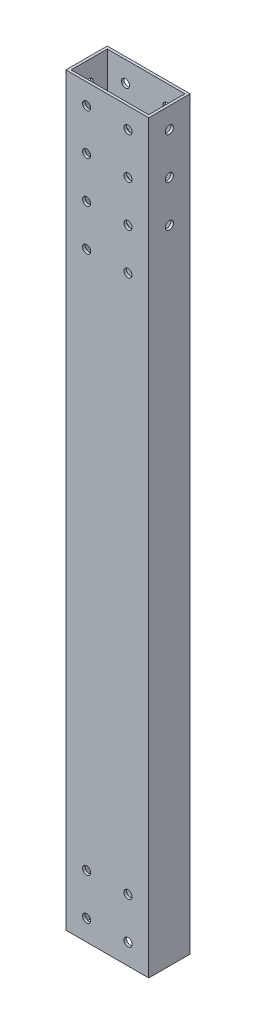
ISO-10303-21;
HEADER;
FILE_DESCRIPTION(('STEP AP214'),'2;1');
FILE_NAME('part.step','',(''),(''),'','','');
FILE_SCHEMA(('AUTOMOTIVE_DESIGN { 1 0 10303 214 1 1 1 1 }'));
ENDSEC;
DATA;
#1=APPLICATION_CONTEXT('core data for automotive mechanical design processes');
#2=APPLICATION_PROTOCOL_DEFINITION('international standard','automotive_design',2000,#1);
#3=PRODUCT_CONTEXT('',#1,'mechanical');
#4=PRODUCT('Part','Part','',(#3));
#5=PRODUCT_RELATED_PRODUCT_CATEGORY('part','',(#4));
#6=PRODUCT_DEFINITION_FORMATION('','',#4);
#7=PRODUCT_DEFINITION_CONTEXT('part definition',#1,'design');
#8=PRODUCT_DEFINITION('design','',#6,#7);
#9=PRODUCT_DEFINITION_SHAPE('','',#8);
#10=(LENGTH_UNIT() NAMED_UNIT(*) SI_UNIT(.MILLI.,.METRE.));
#11=(NAMED_UNIT(*) PLANE_ANGLE_UNIT() SI_UNIT($,.RADIAN.));
#12=(NAMED_UNIT(*) SI_UNIT($,.STERADIAN.) SOLID_ANGLE_UNIT());
#13=UNCERTAINTY_MEASURE_WITH_UNIT(LENGTH_MEASURE(1.E-05),#10,'distance_accuracy_value','');
#14=(GEOMETRIC_REPRESENTATION_CONTEXT(3) GLOBAL_UNCERTAINTY_ASSIGNED_CONTEXT((#13)) GLOBAL_UNIT_ASSIGNED_CONTEXT((#10,
#11,#12)) REPRESENTATION_CONTEXT('',''));
#15=CARTESIAN_POINT('',(0.,0.,0.));
#16=DIRECTION('',(0.,0.,1.));
#17=DIRECTION('',(1.,0.,0.));
#18=AXIS2_PLACEMENT_3D('',#15,#16,#17);
#19=CARTESIAN_POINT('',(533.4,500.126,12.7));
#20=DIRECTION('',(0.,-1.,0.));
#21=DIRECTION('',(1.,0.,0.));
#22=AXIS2_PLACEMENT_3D('',#19,#20,#21);
#23=PLANE('',#22);
#24=DIRECTION('',(-1.,0.,0.));
#25=VECTOR('',#24,1.);
#26=CARTESIAN_POINT('',(533.4,500.126,-12.7));
#27=LINE('',#26,#25);
#28=CARTESIAN_POINT('',(533.4,500.126,-12.7));
#29=VERTEX_POINT('',#28);
#30=CARTESIAN_POINT('',(482.6,500.126,-12.7));
#31=VERTEX_POINT('',#30);
#32=EDGE_CURVE('E134',#29,#31,#27,.T.);
#33=ORIENTED_EDGE('',*,*,#32,.T.);
#34=DIRECTION('',(0.,0.,-1.));
#35=VECTOR('',#34,1.);
#36=CARTESIAN_POINT('',(482.6,500.126,12.7));
#37=LINE('',#36,#35);
#38=CARTESIAN_POINT('',(482.6,500.126,12.7));
#39=VERTEX_POINT('',#38);
#40=EDGE_CURVE('E11',#39,#31,#37,.T.);
#41=ORIENTED_EDGE('',*,*,#40,.F.);
#42=DIRECTION('',(-1.,0.,0.));
#43=VECTOR('',#42,1.);
#44=CARTESIAN_POINT('',(533.4,500.126,12.7));
#45=LINE('',#44,#43);
#46=CARTESIAN_POINT('',(533.4,500.126,12.7));
#47=VERTEX_POINT('',#46);
#48=EDGE_CURVE('E140',#47,#39,#45,.T.);
#49=ORIENTED_EDGE('',*,*,#48,.F.);
#50=DIRECTION('',(0.,0.,-1.));
#51=VECTOR('',#50,1.);
#52=CARTESIAN_POINT('',(533.4,500.126,12.7));
#53=LINE('',#52,#51);
#54=EDGE_CURVE('E152',#47,#29,#53,.T.);
#55=ORIENTED_EDGE('',*,*,#54,.T.);
#56=EDGE_LOOP('',(#33,#41,#49,#55));
#57=FACE_BOUND('',#56,.T.);
#58=DIRECTION('',(-1.,0.,0.));
#59=VECTOR('',#58,1.);
#60=CARTESIAN_POINT('',(533.4,500.126,-11.1125));
#61=LINE('',#60,#59);
#62=CARTESIAN_POINT('',(531.8125,500.126,-11.1125));
#63=VERTEX_POINT('',#62);
#64=CARTESIAN_POINT('',(484.1875,500.126,-11.1125));
#65=VERTEX_POINT('',#64);
#66=EDGE_CURVE('E120',#63,#65,#61,.T.);
#67=ORIENTED_EDGE('',*,*,#66,.F.);
#68=DIRECTION('',(0.,0.,-1.));
#69=VECTOR('',#68,1.);
#70=CARTESIAN_POINT('',(531.8125,500.126,12.7));
#71=LINE('',#70,#69);
#72=CARTESIAN_POINT('',(531.8125,500.126,11.1125));
#73=VERTEX_POINT('',#72);
#74=EDGE_CURVE('E131',#73,#63,#71,.T.);
#75=ORIENTED_EDGE('',*,*,#74,.F.);
#76=DIRECTION('',(-1.,0.,0.));
#77=VECTOR('',#76,1.);
#78=CARTESIAN_POINT('',(533.4,500.126,11.1125));
#79=LINE('',#78,#77);
#80=CARTESIAN_POINT('',(484.1875,500.126,11.1125));
#81=VERTEX_POINT('',#80);
#82=EDGE_CURVE('E127',#73,#81,#79,.T.);
#83=ORIENTED_EDGE('',*,*,#82,.T.);
#84=DIRECTION('',(0.,0.,-1.));
#85=VECTOR('',#84,1.);
#86=CARTESIAN_POINT('',(484.1875,500.126,12.7));
#87=LINE('',#86,#85);
#88=EDGE_CURVE('E111',#81,#65,#87,.T.);
#89=ORIENTED_EDGE('',*,*,#88,.T.);
#90=EDGE_LOOP('',(#67,#75,#83,#89));
#91=FACE_BOUND('',#90,.T.);
#92=ADVANCED_FACE('F37',(#57,#91),#23,.F.);
#93=CARTESIAN_POINT('',(533.4,42.926,12.7));
#94=DIRECTION('',(0.,-1.,0.));
#95=DIRECTION('',(1.,0.,0.));
#96=AXIS2_PLACEMENT_3D('',#93,#94,#95);
#97=PLANE('',#96);
#98=DIRECTION('',(-1.,0.,0.));
#99=VECTOR('',#98,1.);
#100=CARTESIAN_POINT('',(533.4,42.926,-12.7));
#101=LINE('',#100,#99);
#102=CARTESIAN_POINT('',(533.4,42.926,-12.7));
#103=VERTEX_POINT('',#102);
#104=CARTESIAN_POINT('',(482.6,42.926,-12.7));
#105=VERTEX_POINT('',#104);
#106=EDGE_CURVE('E158',#103,#105,#101,.T.);
#107=ORIENTED_EDGE('',*,*,#106,.F.);
#108=DIRECTION('',(0.,0.,-1.));
#109=VECTOR('',#108,1.);
#110=CARTESIAN_POINT('',(533.4,42.926,12.7));
#111=LINE('',#110,#109);
#112=CARTESIAN_POINT('',(533.4,42.926,12.7));
#113=VERTEX_POINT('',#112);
#114=EDGE_CURVE('E164',#113,#103,#111,.T.);
#115=ORIENTED_EDGE('',*,*,#114,.F.);
#116=DIRECTION('',(-1.,0.,0.));
#117=VECTOR('',#116,1.);
#118=CARTESIAN_POINT('',(533.4,42.926,12.7));
#119=LINE('',#118,#117);
#120=CARTESIAN_POINT('',(482.6,42.926,12.7));
#121=VERTEX_POINT('',#120);
#122=EDGE_CURVE('E146',#113,#121,#119,.T.);
#123=ORIENTED_EDGE('',*,*,#122,.T.);
#124=DIRECTION('',(0.,0.,-1.));
#125=VECTOR('',#124,1.);
#126=CARTESIAN_POINT('',(482.6,42.926,12.7));
#127=LINE('',#126,#125);
#128=EDGE_CURVE('E45',#121,#105,#127,.T.);
#129=ORIENTED_EDGE('',*,*,#128,.T.);
#130=EDGE_LOOP('',(#107,#115,#123,#129));
#131=FACE_BOUND('',#130,.T.);
#132=DIRECTION('',(0.,0.,-1.));
#133=VECTOR('',#132,1.);
#134=CARTESIAN_POINT('',(531.8125,42.926,12.7));
#135=LINE('',#134,#133);
#136=CARTESIAN_POINT('',(531.8125,42.926,11.1125));
#137=VERTEX_POINT('',#136);
#138=CARTESIAN_POINT('',(531.8125,42.926,-11.1125));
#139=VERTEX_POINT('',#138);
#140=EDGE_CURVE('E112',#137,#139,#135,.T.);
#141=ORIENTED_EDGE('',*,*,#140,.T.);
#142=DIRECTION('',(-1.,0.,0.));
#143=VECTOR('',#142,1.);
#144=CARTESIAN_POINT('',(533.4,42.926,-11.1125));
#145=LINE('',#144,#143);
#146=CARTESIAN_POINT('',(484.1875,42.926,-11.1125));
#147=VERTEX_POINT('',#146);
#148=EDGE_CURVE('E117',#139,#147,#145,.T.);
#149=ORIENTED_EDGE('',*,*,#148,.T.);
#150=DIRECTION('',(0.,0.,-1.));
#151=VECTOR('',#150,1.);
#152=CARTESIAN_POINT('',(484.1875,42.926,12.7));
#153=LINE('',#152,#151);
#154=CARTESIAN_POINT('',(484.1875,42.926,11.1125));
#155=VERTEX_POINT('',#154);
#156=EDGE_CURVE('E102',#155,#147,#153,.T.);
#157=ORIENTED_EDGE('',*,*,#156,.F.);
#158=DIRECTION('',(-1.,0.,0.));
#159=VECTOR('',#158,1.);
#160=CARTESIAN_POINT('',(533.4,42.926,11.1125));
#161=LINE('',#160,#159);
#162=EDGE_CURVE('E60',#137,#155,#161,.T.);
#163=ORIENTED_EDGE('',*,*,#162,.F.);
#164=EDGE_LOOP('',(#141,#149,#157,#163));
#165=FACE_BOUND('',#164,.T.);
#166=ADVANCED_FACE('F124',(#131,#165),#97,.T.);
#167=CARTESIAN_POINT('',(482.6,500.126,12.7));
#168=DIRECTION('',(1.,0.,0.));
#169=DIRECTION('',(0.,0.,-1.));
#170=AXIS2_PLACEMENT_3D('',#167,#168,#169);
#171=PLANE('',#170);
#172=CARTESIAN_POINT('',(482.6,487.426,0.));
#173=DIRECTION('',(-1.,0.,0.));
#174=DIRECTION('',(0.,0.,1.));
#175=AXIS2_PLACEMENT_3D('',#172,#173,#174);
#176=CIRCLE('',#175,2.48919999999995);
#177=CARTESIAN_POINT('',(482.6,487.426,2.48919999999995));
#178=VERTEX_POINT('',#177);
#179=EDGE_CURVE('E366',#178,#178,#176,.T.);
#180=ORIENTED_EDGE('',*,*,#179,.F.);
#181=EDGE_LOOP('',(#180));
#182=FACE_BOUND('',#181,.T.);
#183=CARTESIAN_POINT('',(482.6,462.026,0.));
#184=DIRECTION('',(-1.,0.,0.));
#185=DIRECTION('',(0.,0.,1.));
#186=AXIS2_PLACEMENT_3D('',#183,#184,#185);
#187=CIRCLE('',#186,2.48919999999997);
#188=CARTESIAN_POINT('',(482.6,462.026,2.48919999999997));
#189=VERTEX_POINT('',#188);
#190=EDGE_CURVE('E370',#189,#189,#187,.T.);
#191=ORIENTED_EDGE('',*,*,#190,.F.);
#192=EDGE_LOOP('',(#191));
#193=FACE_BOUND('',#192,.T.);
#194=CARTESIAN_POINT('',(482.6,436.626,0.));
#195=DIRECTION('',(-1.,0.,0.));
#196=DIRECTION('',(0.,0.,1.));
#197=AXIS2_PLACEMENT_3D('',#194,#195,#196);
#198=CIRCLE('',#197,2.48919999999999);
#199=CARTESIAN_POINT('',(482.6,436.626,2.48919999999999));
#200=VERTEX_POINT('',#199);
#201=EDGE_CURVE('E227',#200,#200,#198,.T.);
#202=ORIENTED_EDGE('',*,*,#201,.F.);
#203=EDGE_LOOP('',(#202));
#204=FACE_BOUND('',#203,.T.);
#205=DIRECTION('',(0.,-1.,0.));
#206=VECTOR('',#205,1.);
#207=CARTESIAN_POINT('',(482.6,500.126,-12.7));
#208=LINE('',#207,#206);
#209=EDGE_CURVE('E155',#31,#105,#208,.T.);
#210=ORIENTED_EDGE('',*,*,#209,.T.);
#211=ORIENTED_EDGE('',*,*,#128,.F.);
#212=DIRECTION('',(0.,-1.,0.));
#213=VECTOR('',#212,1.);
#214=CARTESIAN_POINT('',(482.6,500.126,12.7));
#215=LINE('',#214,#213);
#216=EDGE_CURVE('E143',#39,#121,#215,.T.);
#217=ORIENTED_EDGE('',*,*,#216,.F.);
#218=ORIENTED_EDGE('',*,*,#40,.T.);
#219=EDGE_LOOP('',(#210,#211,#217,#218));
#220=FACE_BOUND('',#219,.T.);
#221=ADVANCED_FACE('F328',(#182,#193,#204,#220),#171,.F.);
#222=CARTESIAN_POINT('',(533.4,500.126,12.7));
#223=DIRECTION('',(1.,0.,0.));
#224=DIRECTION('',(0.,0.,-1.));
#225=AXIS2_PLACEMENT_3D('',#222,#223,#224);
#226=PLANE('',#225);
#227=CARTESIAN_POINT('',(533.4,487.426,0.));
#228=DIRECTION('',(-1.,0.,0.));
#229=DIRECTION('',(0.,0.,1.));
#230=AXIS2_PLACEMENT_3D('',#227,#228,#229);
#231=CIRCLE('',#230,2.48919999999995);
#232=CARTESIAN_POINT('',(533.4,487.426,2.48919999999995));
#233=VERTEX_POINT('',#232);
#234=EDGE_CURVE('E203',#233,#233,#231,.T.);
#235=ORIENTED_EDGE('',*,*,#234,.T.);
#236=EDGE_LOOP('',(#235));
#237=FACE_BOUND('',#236,.T.);
#238=CARTESIAN_POINT('',(533.4,462.026,0.));
#239=DIRECTION('',(-1.,0.,0.));
#240=DIRECTION('',(0.,0.,1.));
#241=AXIS2_PLACEMENT_3D('',#238,#239,#240);
#242=CIRCLE('',#241,2.48919999999997);
#243=CARTESIAN_POINT('',(533.4,462.026,2.48919999999997));
#244=VERTEX_POINT('',#243);
#245=EDGE_CURVE('E232',#244,#244,#242,.T.);
#246=ORIENTED_EDGE('',*,*,#245,.T.);
#247=EDGE_LOOP('',(#246));
#248=FACE_BOUND('',#247,.T.);
#249=CARTESIAN_POINT('',(533.4,436.626,0.));
#250=DIRECTION('',(-1.,0.,0.));
#251=DIRECTION('',(0.,0.,1.));
#252=AXIS2_PLACEMENT_3D('',#249,#250,#251);
#253=CIRCLE('',#252,2.48919999999999);
#254=CARTESIAN_POINT('',(533.4,436.626,2.48919999999999));
#255=VERTEX_POINT('',#254);
#256=EDGE_CURVE('E223',#255,#255,#253,.T.);
#257=ORIENTED_EDGE('',*,*,#256,.T.);
#258=EDGE_LOOP('',(#257));
#259=FACE_BOUND('',#258,.T.);
#260=DIRECTION('',(0.,-1.,0.));
#261=VECTOR('',#260,1.);
#262=CARTESIAN_POINT('',(533.4,500.126,-12.7));
#263=LINE('',#262,#261);
#264=EDGE_CURVE('E144',#29,#103,#263,.T.);
#265=ORIENTED_EDGE('',*,*,#264,.F.);
#266=ORIENTED_EDGE('',*,*,#54,.F.);
#267=DIRECTION('',(0.,-1.,0.));
#268=VECTOR('',#267,1.);
#269=CARTESIAN_POINT('',(533.4,500.126,12.7));
#270=LINE('',#269,#268);
#271=EDGE_CURVE('E149',#47,#113,#270,.T.);
#272=ORIENTED_EDGE('',*,*,#271,.T.);
#273=ORIENTED_EDGE('',*,*,#114,.T.);
#274=EDGE_LOOP('',(#265,#266,#272,#273));
#275=FACE_BOUND('',#274,.T.);
#276=ADVANCED_FACE('F337',(#237,#248,#259,#275),#226,.T.);
#277=CARTESIAN_POINT('',(0.,0.,12.7));
#278=DIRECTION('',(0.,0.,1.));
#279=DIRECTION('',(1.,0.,0.));
#280=AXIS2_PLACEMENT_3D('',#277,#278,#279);
#281=PLANE('',#280);
#282=CARTESIAN_POINT('',(495.300000000002,55.626,12.7));
#283=DIRECTION('',(0.,0.,1.));
#284=DIRECTION('',(1.,0.,0.));
#285=AXIS2_PLACEMENT_3D('',#282,#283,#284);
#286=CIRCLE('',#285,2.48920000000001);
#287=CARTESIAN_POINT('',(497.789200000002,55.626,12.7));
#288=VERTEX_POINT('',#287);
#289=EDGE_CURVE('E794',#288,#288,#286,.T.);
#290=ORIENTED_EDGE('',*,*,#289,.F.);
#291=EDGE_LOOP('',(#290));
#292=FACE_BOUND('',#291,.T.);
#293=CARTESIAN_POINT('',(520.700000000002,55.6260000000004,12.7));
#294=DIRECTION('',(0.,0.,1.));
#295=DIRECTION('',(1.,0.,0.));
#296=AXIS2_PLACEMENT_3D('',#293,#294,#295);
#297=CIRCLE('',#296,2.48920000000006);
#298=CARTESIAN_POINT('',(523.189200000002,55.6260000000004,12.7));
#299=VERTEX_POINT('',#298);
#300=EDGE_CURVE('E795',#299,#299,#297,.T.);
#301=ORIENTED_EDGE('',*,*,#300,.F.);
#302=EDGE_LOOP('',(#301));
#303=FACE_BOUND('',#302,.T.);
#304=CARTESIAN_POINT('',(520.700000000002,81.0260000000004,12.7));
#305=DIRECTION('',(0.,0.,1.));
#306=DIRECTION('',(1.,0.,0.));
#307=AXIS2_PLACEMENT_3D('',#304,#305,#306);
#308=CIRCLE('',#307,2.48919999999995);
#309=CARTESIAN_POINT('',(523.189200000002,81.0260000000004,12.7));
#310=VERTEX_POINT('',#309);
#311=EDGE_CURVE('E798',#310,#310,#308,.T.);
#312=ORIENTED_EDGE('',*,*,#311,.F.);
#313=EDGE_LOOP('',(#312));
#314=FACE_BOUND('',#313,.T.);
#315=CARTESIAN_POINT('',(495.300000000002,81.026,12.7));
#316=DIRECTION('',(0.,0.,1.));
#317=DIRECTION('',(1.,0.,0.));
#318=AXIS2_PLACEMENT_3D('',#315,#316,#317);
#319=CIRCLE('',#318,2.48920000000001);
#320=CARTESIAN_POINT('',(497.789200000002,81.026,12.7));
#321=VERTEX_POINT('',#320);
#322=EDGE_CURVE('E216',#321,#321,#319,.T.);
#323=ORIENTED_EDGE('',*,*,#322,.F.);
#324=EDGE_LOOP('',(#323));
#325=FACE_BOUND('',#324,.T.);
#326=CARTESIAN_POINT('',(520.7,436.626,12.7));
#327=DIRECTION('',(0.,0.,1.));
#328=DIRECTION('',(1.,0.,0.));
#329=AXIS2_PLACEMENT_3D('',#326,#327,#328);
#330=CIRCLE('',#329,2.48919999999995);
#331=CARTESIAN_POINT('',(523.1892,436.626,12.7));
#332=VERTEX_POINT('',#331);
#333=EDGE_CURVE('E265',#332,#332,#330,.T.);
#334=ORIENTED_EDGE('',*,*,#333,.F.);
#335=EDGE_LOOP('',(#334));
#336=FACE_BOUND('',#335,.T.);
#337=CARTESIAN_POINT('',(495.3,462.026,12.7));
#338=DIRECTION('',(0.,0.,1.));
#339=DIRECTION('',(1.,0.,0.));
#340=AXIS2_PLACEMENT_3D('',#337,#338,#339);
#341=CIRCLE('',#340,2.48919999999995);
#342=CARTESIAN_POINT('',(497.7892,462.026,12.7));
#343=VERTEX_POINT('',#342);
#344=EDGE_CURVE('E264',#343,#343,#341,.T.);
#345=ORIENTED_EDGE('',*,*,#344,.F.);
#346=EDGE_LOOP('',(#345));
#347=FACE_BOUND('',#346,.T.);
#348=CARTESIAN_POINT('',(520.7,462.026,12.7));
#349=DIRECTION('',(0.,0.,1.));
#350=DIRECTION('',(1.,0.,0.));
#351=AXIS2_PLACEMENT_3D('',#348,#349,#350);
#352=CIRCLE('',#351,2.48919999999995);
#353=CARTESIAN_POINT('',(523.1892,462.026,12.7));
#354=VERTEX_POINT('',#353);
#355=EDGE_CURVE('E277',#354,#354,#352,.T.);
#356=ORIENTED_EDGE('',*,*,#355,.F.);
#357=EDGE_LOOP('',(#356));
#358=FACE_BOUND('',#357,.T.);
#359=CARTESIAN_POINT('',(495.3,487.426,12.7));
#360=DIRECTION('',(0.,0.,1.));
#361=DIRECTION('',(1.,0.,0.));
#362=AXIS2_PLACEMENT_3D('',#359,#360,#361);
#363=CIRCLE('',#362,2.48919999999995);
#364=CARTESIAN_POINT('',(497.7892,487.426,12.7));
#365=VERTEX_POINT('',#364);
#366=EDGE_CURVE('E276',#365,#365,#363,.T.);
#367=ORIENTED_EDGE('',*,*,#366,.F.);
#368=EDGE_LOOP('',(#367));
#369=FACE_BOUND('',#368,.T.);
#370=CARTESIAN_POINT('',(495.3,411.226,12.7));
#371=DIRECTION('',(0.,0.,1.));
#372=DIRECTION('',(1.,0.,0.));
#373=AXIS2_PLACEMENT_3D('',#370,#371,#372);
#374=CIRCLE('',#373,2.48920000000001);
#375=CARTESIAN_POINT('',(497.7892,411.226,12.7));
#376=VERTEX_POINT('',#375);
#377=EDGE_CURVE('E245',#376,#376,#374,.T.);
#378=ORIENTED_EDGE('',*,*,#377,.F.);
#379=EDGE_LOOP('',(#378));
#380=FACE_BOUND('',#379,.T.);
#381=CARTESIAN_POINT('',(495.3,436.626,12.7));
#382=DIRECTION('',(0.,0.,1.));
#383=DIRECTION('',(1.,0.,0.));
#384=AXIS2_PLACEMENT_3D('',#381,#382,#383);
#385=CIRCLE('',#384,2.48919999999995);
#386=CARTESIAN_POINT('',(497.7892,436.626,12.7));
#387=VERTEX_POINT('',#386);
#388=EDGE_CURVE('E253',#387,#387,#385,.T.);
#389=ORIENTED_EDGE('',*,*,#388,.F.);
#390=EDGE_LOOP('',(#389));
#391=FACE_BOUND('',#390,.T.);
#392=CARTESIAN_POINT('',(520.7,411.226,12.7));
#393=DIRECTION('',(0.,0.,1.));
#394=DIRECTION('',(1.,0.,0.));
#395=AXIS2_PLACEMENT_3D('',#392,#393,#394);
#396=CIRCLE('',#395,2.48920000000006);
#397=CARTESIAN_POINT('',(523.1892,411.226,12.7));
#398=VERTEX_POINT('',#397);
#399=EDGE_CURVE('E252',#398,#398,#396,.T.);
#400=ORIENTED_EDGE('',*,*,#399,.F.);
#401=EDGE_LOOP('',(#400));
#402=FACE_BOUND('',#401,.T.);
#403=CARTESIAN_POINT('',(520.7,487.426,12.7));
#404=DIRECTION('',(0.,0.,1.));
#405=DIRECTION('',(1.,0.,0.));
#406=AXIS2_PLACEMENT_3D('',#403,#404,#405);
#407=CIRCLE('',#406,2.48920000000006);
#408=CARTESIAN_POINT('',(523.1892,487.426,12.7));
#409=VERTEX_POINT('',#408);
#410=EDGE_CURVE('E280',#409,#409,#407,.T.);
#411=ORIENTED_EDGE('',*,*,#410,.F.);
#412=EDGE_LOOP('',(#411));
#413=FACE_BOUND('',#412,.T.);
#414=ORIENTED_EDGE('',*,*,#48,.T.);
#415=ORIENTED_EDGE('',*,*,#216,.T.);
#416=ORIENTED_EDGE('',*,*,#122,.F.);
#417=ORIENTED_EDGE('',*,*,#271,.F.);
#418=EDGE_LOOP('',(#414,#415,#416,#417));
#419=FACE_BOUND('',#418,.T.);
#420=ADVANCED_FACE('F344',(#292,#303,#314,#325,#336,#347,#358,#369,#380,#391,#402,#413,#419),
#281,.T.);
#421=CARTESIAN_POINT('',(0.,0.,-12.7));
#422=DIRECTION('',(0.,0.,1.));
#423=DIRECTION('',(1.,0.,0.));
#424=AXIS2_PLACEMENT_3D('',#421,#422,#423);
#425=PLANE('',#424);
#426=CARTESIAN_POINT('',(520.7,436.626,-12.7));
#427=DIRECTION('',(0.,0.,1.));
#428=DIRECTION('',(1.,0.,0.));
#429=AXIS2_PLACEMENT_3D('',#426,#427,#428);
#430=CIRCLE('',#429,2.48919999999995);
#431=CARTESIAN_POINT('',(523.1892,436.626,-12.7));
#432=VERTEX_POINT('',#431);
#433=EDGE_CURVE('E256',#432,#432,#430,.T.);
#434=ORIENTED_EDGE('',*,*,#433,.T.);
#435=EDGE_LOOP('',(#434));
#436=FACE_BOUND('',#435,.T.);
#437=CARTESIAN_POINT('',(495.3,462.026,-12.7));
#438=DIRECTION('',(0.,0.,1.));
#439=DIRECTION('',(1.,0.,0.));
#440=AXIS2_PLACEMENT_3D('',#437,#438,#439);
#441=CIRCLE('',#440,2.48919999999995);
#442=CARTESIAN_POINT('',(497.7892,462.026,-12.7));
#443=VERTEX_POINT('',#442);
#444=EDGE_CURVE('E261',#443,#443,#441,.T.);
#445=ORIENTED_EDGE('',*,*,#444,.T.);
#446=EDGE_LOOP('',(#445));
#447=FACE_BOUND('',#446,.T.);
#448=CARTESIAN_POINT('',(520.7,462.026,-12.7));
#449=DIRECTION('',(0.,0.,1.));
#450=DIRECTION('',(1.,0.,0.));
#451=AXIS2_PLACEMENT_3D('',#448,#449,#450);
#452=CIRCLE('',#451,2.48919999999995);
#453=CARTESIAN_POINT('',(523.1892,462.026,-12.7));
#454=VERTEX_POINT('',#453);
#455=EDGE_CURVE('E268',#454,#454,#452,.T.);
#456=ORIENTED_EDGE('',*,*,#455,.T.);
#457=EDGE_LOOP('',(#456));
#458=FACE_BOUND('',#457,.T.);
#459=CARTESIAN_POINT('',(495.3,487.426,-12.7));
#460=DIRECTION('',(0.,0.,1.));
#461=DIRECTION('',(1.,0.,0.));
#462=AXIS2_PLACEMENT_3D('',#459,#460,#461);
#463=CIRCLE('',#462,2.48919999999995);
#464=CARTESIAN_POINT('',(497.7892,487.426,-12.7));
#465=VERTEX_POINT('',#464);
#466=EDGE_CURVE('E273',#465,#465,#463,.T.);
#467=ORIENTED_EDGE('',*,*,#466,.T.);
#468=EDGE_LOOP('',(#467));
#469=FACE_BOUND('',#468,.T.);
#470=CARTESIAN_POINT('',(495.3,411.226,-12.7));
#471=DIRECTION('',(0.,0.,1.));
#472=DIRECTION('',(1.,0.,0.));
#473=AXIS2_PLACEMENT_3D('',#470,#471,#472);
#474=CIRCLE('',#473,2.48920000000001);
#475=CARTESIAN_POINT('',(497.7892,411.226,-12.7));
#476=VERTEX_POINT('',#475);
#477=EDGE_CURVE('E242',#476,#476,#474,.T.);
#478=ORIENTED_EDGE('',*,*,#477,.T.);
#479=EDGE_LOOP('',(#478));
#480=FACE_BOUND('',#479,.T.);
#481=CARTESIAN_POINT('',(495.3,436.626,-12.7));
#482=DIRECTION('',(0.,0.,1.));
#483=DIRECTION('',(1.,0.,0.));
#484=AXIS2_PLACEMENT_3D('',#481,#482,#483);
#485=CIRCLE('',#484,2.48919999999995);
#486=CARTESIAN_POINT('',(497.7892,436.626,-12.7));
#487=VERTEX_POINT('',#486);
#488=EDGE_CURVE('E248',#487,#487,#485,.T.);
#489=ORIENTED_EDGE('',*,*,#488,.T.);
#490=EDGE_LOOP('',(#489));
#491=FACE_BOUND('',#490,.T.);
#492=CARTESIAN_POINT('',(520.7,411.226,-12.7));
#493=DIRECTION('',(0.,0.,1.));
#494=DIRECTION('',(1.,0.,0.));
#495=AXIS2_PLACEMENT_3D('',#492,#493,#494);
#496=CIRCLE('',#495,2.48920000000006);
#497=CARTESIAN_POINT('',(523.1892,411.226,-12.7));
#498=VERTEX_POINT('',#497);
#499=EDGE_CURVE('E249',#498,#498,#496,.T.);
#500=ORIENTED_EDGE('',*,*,#499,.T.);
#501=EDGE_LOOP('',(#500));
#502=FACE_BOUND('',#501,.T.);
#503=CARTESIAN_POINT('',(520.7,487.426,-12.7));
#504=DIRECTION('',(0.,0.,1.));
#505=DIRECTION('',(1.,0.,0.));
#506=AXIS2_PLACEMENT_3D('',#503,#504,#505);
#507=CIRCLE('',#506,2.48920000000006);
#508=CARTESIAN_POINT('',(523.1892,487.426,-12.7));
#509=VERTEX_POINT('',#508);
#510=EDGE_CURVE('E171',#509,#509,#507,.T.);
#511=ORIENTED_EDGE('',*,*,#510,.T.);
#512=EDGE_LOOP('',(#511));
#513=FACE_BOUND('',#512,.T.);
#514=ORIENTED_EDGE('',*,*,#32,.F.);
#515=ORIENTED_EDGE('',*,*,#264,.T.);
#516=ORIENTED_EDGE('',*,*,#106,.T.);
#517=ORIENTED_EDGE('',*,*,#209,.F.);
#518=EDGE_LOOP('',(#514,#515,#516,#517));
#519=FACE_BOUND('',#518,.T.);
#520=ADVANCED_FACE('F319',(#436,#447,#458,#469,#480,#491,#502,#513,#519),#425,.F.);
#521=CARTESIAN_POINT('',(484.1875,500.126,12.7));
#522=DIRECTION('',(1.,0.,0.));
#523=DIRECTION('',(0.,0.,-1.));
#524=AXIS2_PLACEMENT_3D('',#521,#522,#523);
#525=PLANE('',#524);
#526=CARTESIAN_POINT('',(484.1875,487.426,0.));
#527=DIRECTION('',(1.,0.,0.));
#528=DIRECTION('',(0.,0.,-1.));
#529=AXIS2_PLACEMENT_3D('',#526,#527,#528);
#530=CIRCLE('',#529,2.48919999999995);
#531=CARTESIAN_POINT('',(484.1875,487.426,-2.48919999999995));
#532=VERTEX_POINT('',#531);
#533=EDGE_CURVE('E211',#532,#532,#530,.T.);
#534=ORIENTED_EDGE('',*,*,#533,.F.);
#535=EDGE_LOOP('',(#534));
#536=FACE_BOUND('',#535,.T.);
#537=CARTESIAN_POINT('',(484.1875,462.026,0.));
#538=DIRECTION('',(1.,0.,0.));
#539=DIRECTION('',(0.,0.,-1.));
#540=AXIS2_PLACEMENT_3D('',#537,#538,#539);
#541=CIRCLE('',#540,2.48919999999997);
#542=CARTESIAN_POINT('',(484.1875,462.026,-2.48919999999997));
#543=VERTEX_POINT('',#542);
#544=EDGE_CURVE('E207',#543,#543,#541,.T.);
#545=ORIENTED_EDGE('',*,*,#544,.F.);
#546=EDGE_LOOP('',(#545));
#547=FACE_BOUND('',#546,.T.);
#548=CARTESIAN_POINT('',(484.1875,436.626,0.));
#549=DIRECTION('',(1.,0.,0.));
#550=DIRECTION('',(0.,0.,-1.));
#551=AXIS2_PLACEMENT_3D('',#548,#549,#550);
#552=CIRCLE('',#551,2.48919999999999);
#553=CARTESIAN_POINT('',(484.1875,436.626,-2.48919999999999));
#554=VERTEX_POINT('',#553);
#555=EDGE_CURVE('E202',#554,#554,#552,.T.);
#556=ORIENTED_EDGE('',*,*,#555,.F.);
#557=EDGE_LOOP('',(#556));
#558=FACE_BOUND('',#557,.T.);
#559=DIRECTION('',(0.,-1.,0.));
#560=VECTOR('',#559,1.);
#561=CARTESIAN_POINT('',(484.1875,500.126,-11.1125));
#562=LINE('',#561,#560);
#563=EDGE_CURVE('E106',#65,#147,#562,.T.);
#564=ORIENTED_EDGE('',*,*,#563,.F.);
#565=ORIENTED_EDGE('',*,*,#88,.F.);
#566=DIRECTION('',(0.,-1.,0.));
#567=VECTOR('',#566,1.);
#568=CARTESIAN_POINT('',(484.1875,500.126,11.1125));
#569=LINE('',#568,#567);
#570=EDGE_CURVE('E108',#81,#155,#569,.T.);
#571=ORIENTED_EDGE('',*,*,#570,.T.);
#572=ORIENTED_EDGE('',*,*,#156,.T.);
#573=EDGE_LOOP('',(#564,#565,#571,#572));
#574=FACE_BOUND('',#573,.T.);
#575=ADVANCED_FACE('F104',(#536,#547,#558,#574),#525,.T.);
#576=CARTESIAN_POINT('',(531.8125,500.126,12.7));
#577=DIRECTION('',(1.,0.,0.));
#578=DIRECTION('',(0.,0.,-1.));
#579=AXIS2_PLACEMENT_3D('',#576,#577,#578);
#580=PLANE('',#579);
#581=CARTESIAN_POINT('',(531.8125,487.426,0.));
#582=DIRECTION('',(1.,0.,0.));
#583=DIRECTION('',(0.,0.,-1.));
#584=AXIS2_PLACEMENT_3D('',#581,#582,#583);
#585=CIRCLE('',#584,2.48919999999995);
#586=CARTESIAN_POINT('',(531.8125,487.426,-2.48919999999995));
#587=VERTEX_POINT('',#586);
#588=EDGE_CURVE('E208',#587,#587,#585,.T.);
#589=ORIENTED_EDGE('',*,*,#588,.T.);
#590=EDGE_LOOP('',(#589));
#591=FACE_BOUND('',#590,.T.);
#592=CARTESIAN_POINT('',(531.8125,462.026,0.));
#593=DIRECTION('',(1.,0.,0.));
#594=DIRECTION('',(0.,0.,-1.));
#595=AXIS2_PLACEMENT_3D('',#592,#593,#594);
#596=CIRCLE('',#595,2.48919999999997);
#597=CARTESIAN_POINT('',(531.8125,462.026,-2.48919999999997));
#598=VERTEX_POINT('',#597);
#599=EDGE_CURVE('E204',#598,#598,#596,.T.);
#600=ORIENTED_EDGE('',*,*,#599,.T.);
#601=EDGE_LOOP('',(#600));
#602=FACE_BOUND('',#601,.T.);
#603=CARTESIAN_POINT('',(531.8125,436.626,0.));
#604=DIRECTION('',(1.,0.,0.));
#605=DIRECTION('',(0.,0.,-1.));
#606=AXIS2_PLACEMENT_3D('',#603,#604,#605);
#607=CIRCLE('',#606,2.48919999999999);
#608=CARTESIAN_POINT('',(531.8125,436.626,-2.48919999999999));
#609=VERTEX_POINT('',#608);
#610=EDGE_CURVE('E199',#609,#609,#607,.T.);
#611=ORIENTED_EDGE('',*,*,#610,.T.);
#612=EDGE_LOOP('',(#611));
#613=FACE_BOUND('',#612,.T.);
#614=DIRECTION('',(0.,-1.,0.));
#615=VECTOR('',#614,1.);
#616=CARTESIAN_POINT('',(531.8125,500.126,-11.1125));
#617=LINE('',#616,#615);
#618=EDGE_CURVE('E125',#63,#139,#617,.T.);
#619=ORIENTED_EDGE('',*,*,#618,.T.);
#620=ORIENTED_EDGE('',*,*,#140,.F.);
#621=DIRECTION('',(0.,-1.,0.));
#622=VECTOR('',#621,1.);
#623=CARTESIAN_POINT('',(531.8125,500.126,11.1125));
#624=LINE('',#623,#622);
#625=EDGE_CURVE('E53',#73,#137,#624,.T.);
#626=ORIENTED_EDGE('',*,*,#625,.F.);
#627=ORIENTED_EDGE('',*,*,#74,.T.);
#628=EDGE_LOOP('',(#619,#620,#626,#627));
#629=FACE_BOUND('',#628,.T.);
#630=ADVANCED_FACE('F309',(#591,#602,#613,#629),#580,.F.);
#631=CARTESIAN_POINT('',(0.,0.,11.1125));
#632=DIRECTION('',(0.,0.,1.));
#633=DIRECTION('',(1.,0.,0.));
#634=AXIS2_PLACEMENT_3D('',#631,#632,#633);
#635=PLANE('',#634);
#636=CARTESIAN_POINT('',(495.300000000002,55.626,11.1125));
#637=DIRECTION('',(0.,0.,1.));
#638=DIRECTION('',(1.,0.,0.));
#639=AXIS2_PLACEMENT_3D('',#636,#637,#638);
#640=CIRCLE('',#639,2.48920000000001);
#641=CARTESIAN_POINT('',(497.789200000002,55.626,11.1125));
#642=VERTEX_POINT('',#641);
#643=EDGE_CURVE('E40',#642,#642,#640,.F.);
#644=ORIENTED_EDGE('',*,*,#643,.F.);
#645=EDGE_LOOP('',(#644));
#646=FACE_BOUND('',#645,.T.);
#647=CARTESIAN_POINT('',(520.700000000002,55.6260000000004,11.1125));
#648=DIRECTION('',(0.,0.,1.));
#649=DIRECTION('',(1.,0.,0.));
#650=AXIS2_PLACEMENT_3D('',#647,#648,#649);
#651=CIRCLE('',#650,2.48920000000006);
#652=CARTESIAN_POINT('',(523.189200000002,55.6260000000004,11.1125));
#653=VERTEX_POINT('',#652);
#654=EDGE_CURVE('E218',#653,#653,#651,.F.);
#655=ORIENTED_EDGE('',*,*,#654,.F.);
#656=EDGE_LOOP('',(#655));
#657=FACE_BOUND('',#656,.T.);
#658=CARTESIAN_POINT('',(520.700000000002,81.0260000000004,11.1125));
#659=DIRECTION('',(0.,0.,1.));
#660=DIRECTION('',(1.,0.,0.));
#661=AXIS2_PLACEMENT_3D('',#658,#659,#660);
#662=CIRCLE('',#661,2.48919999999995);
#663=CARTESIAN_POINT('',(523.189200000002,81.0260000000004,11.1125));
#664=VERTEX_POINT('',#663);
#665=EDGE_CURVE('E215',#664,#664,#662,.F.);
#666=ORIENTED_EDGE('',*,*,#665,.F.);
#667=EDGE_LOOP('',(#666));
#668=FACE_BOUND('',#667,.T.);
#669=CARTESIAN_POINT('',(495.300000000002,81.026,11.1125));
#670=DIRECTION('',(0.,0.,1.));
#671=DIRECTION('',(1.,0.,0.));
#672=AXIS2_PLACEMENT_3D('',#669,#670,#671);
#673=CIRCLE('',#672,2.48920000000001);
#674=CARTESIAN_POINT('',(497.789200000002,81.026,11.1125));
#675=VERTEX_POINT('',#674);
#676=EDGE_CURVE('E212',#675,#675,#673,.F.);
#677=ORIENTED_EDGE('',*,*,#676,.F.);
#678=EDGE_LOOP('',(#677));
#679=FACE_BOUND('',#678,.T.);
#680=CARTESIAN_POINT('',(520.7,436.626,11.1125));
#681=DIRECTION('',(0.,0.,1.));
#682=DIRECTION('',(1.,0.,0.));
#683=AXIS2_PLACEMENT_3D('',#680,#681,#682);
#684=CIRCLE('',#683,2.48919999999995);
#685=CARTESIAN_POINT('',(523.1892,436.626,11.1125));
#686=VERTEX_POINT('',#685);
#687=EDGE_CURVE('E139',#686,#686,#684,.T.);
#688=ORIENTED_EDGE('',*,*,#687,.T.);
#689=EDGE_LOOP('',(#688));
#690=FACE_BOUND('',#689,.T.);
#691=CARTESIAN_POINT('',(495.3,462.026,11.1125));
#692=DIRECTION('',(0.,0.,1.));
#693=DIRECTION('',(1.,0.,0.));
#694=AXIS2_PLACEMENT_3D('',#691,#692,#693);
#695=CIRCLE('',#694,2.48919999999995);
#696=CARTESIAN_POINT('',(497.7892,462.026,11.1125));
#697=VERTEX_POINT('',#696);
#698=EDGE_CURVE('E195',#697,#697,#695,.T.);
#699=ORIENTED_EDGE('',*,*,#698,.T.);
#700=EDGE_LOOP('',(#699));
#701=FACE_BOUND('',#700,.T.);
#702=CARTESIAN_POINT('',(520.7,462.026,11.1125));
#703=DIRECTION('',(0.,0.,1.));
#704=DIRECTION('',(1.,0.,0.));
#705=AXIS2_PLACEMENT_3D('',#702,#703,#704);
#706=CIRCLE('',#705,2.48919999999995);
#707=CARTESIAN_POINT('',(523.1892,462.026,11.1125));
#708=VERTEX_POINT('',#707);
#709=EDGE_CURVE('E191',#708,#708,#706,.T.);
#710=ORIENTED_EDGE('',*,*,#709,.T.);
#711=EDGE_LOOP('',(#710));
#712=FACE_BOUND('',#711,.T.);
#713=CARTESIAN_POINT('',(495.3,487.426,11.1125));
#714=DIRECTION('',(0.,0.,1.));
#715=DIRECTION('',(1.,0.,0.));
#716=AXIS2_PLACEMENT_3D('',#713,#714,#715);
#717=CIRCLE('',#716,2.48919999999995);
#718=CARTESIAN_POINT('',(497.7892,487.426,11.1125));
#719=VERTEX_POINT('',#718);
#720=EDGE_CURVE('E187',#719,#719,#717,.T.);
#721=ORIENTED_EDGE('',*,*,#720,.T.);
#722=EDGE_LOOP('',(#721));
#723=FACE_BOUND('',#722,.T.);
#724=CARTESIAN_POINT('',(495.3,411.226,11.1125));
#725=DIRECTION('',(0.,0.,1.));
#726=DIRECTION('',(1.,0.,0.));
#727=AXIS2_PLACEMENT_3D('',#724,#725,#726);
#728=CIRCLE('',#727,2.48920000000001);
#729=CARTESIAN_POINT('',(497.7892,411.226,11.1125));
#730=VERTEX_POINT('',#729);
#731=EDGE_CURVE('E183',#730,#730,#728,.T.);
#732=ORIENTED_EDGE('',*,*,#731,.T.);
#733=EDGE_LOOP('',(#732));
#734=FACE_BOUND('',#733,.T.);
#735=CARTESIAN_POINT('',(495.3,436.626,11.1125));
#736=DIRECTION('',(0.,0.,1.));
#737=DIRECTION('',(1.,0.,0.));
#738=AXIS2_PLACEMENT_3D('',#735,#736,#737);
#739=CIRCLE('',#738,2.48919999999995);
#740=CARTESIAN_POINT('',(497.7892,436.626,11.1125));
#741=VERTEX_POINT('',#740);
#742=EDGE_CURVE('E179',#741,#741,#739,.T.);
#743=ORIENTED_EDGE('',*,*,#742,.T.);
#744=EDGE_LOOP('',(#743));
#745=FACE_BOUND('',#744,.T.);
#746=CARTESIAN_POINT('',(520.7,411.226,11.1125));
#747=DIRECTION('',(0.,0.,1.));
#748=DIRECTION('',(1.,0.,0.));
#749=AXIS2_PLACEMENT_3D('',#746,#747,#748);
#750=CIRCLE('',#749,2.48920000000006);
#751=CARTESIAN_POINT('',(523.1892,411.226,11.1125));
#752=VERTEX_POINT('',#751);
#753=EDGE_CURVE('E175',#752,#752,#750,.T.);
#754=ORIENTED_EDGE('',*,*,#753,.T.);
#755=EDGE_LOOP('',(#754));
#756=FACE_BOUND('',#755,.T.);
#757=CARTESIAN_POINT('',(520.7,487.426,11.1125));
#758=DIRECTION('',(0.,0.,1.));
#759=DIRECTION('',(1.,0.,0.));
#760=AXIS2_PLACEMENT_3D('',#757,#758,#759);
#761=CIRCLE('',#760,2.48920000000006);
#762=CARTESIAN_POINT('',(523.1892,487.426,11.1125));
#763=VERTEX_POINT('',#762);
#764=EDGE_CURVE('E170',#763,#763,#761,.T.);
#765=ORIENTED_EDGE('',*,*,#764,.T.);
#766=EDGE_LOOP('',(#765));
#767=FACE_BOUND('',#766,.T.);
#768=ORIENTED_EDGE('',*,*,#82,.F.);
#769=ORIENTED_EDGE('',*,*,#625,.T.);
#770=ORIENTED_EDGE('',*,*,#162,.T.);
#771=ORIENTED_EDGE('',*,*,#570,.F.);
#772=EDGE_LOOP('',(#768,#769,#770,#771));
#773=FACE_BOUND('',#772,.T.);
#774=ADVANCED_FACE('F306',(#646,#657,#668,#679,#690,#701,#712,#723,#734,#745,#756,#767,#773),
#635,.F.);
#775=CARTESIAN_POINT('',(0.,0.,-11.1125));
#776=DIRECTION('',(0.,0.,1.));
#777=DIRECTION('',(1.,0.,0.));
#778=AXIS2_PLACEMENT_3D('',#775,#776,#777);
#779=PLANE('',#778);
#780=CARTESIAN_POINT('',(520.7,436.626,-11.1125));
#781=DIRECTION('',(0.,0.,1.));
#782=DIRECTION('',(1.,0.,0.));
#783=AXIS2_PLACEMENT_3D('',#780,#781,#782);
#784=CIRCLE('',#783,2.48919999999995);
#785=CARTESIAN_POINT('',(523.1892,436.626,-11.1125));
#786=VERTEX_POINT('',#785);
#787=EDGE_CURVE('E196',#786,#786,#784,.T.);
#788=ORIENTED_EDGE('',*,*,#787,.F.);
#789=EDGE_LOOP('',(#788));
#790=FACE_BOUND('',#789,.T.);
#791=CARTESIAN_POINT('',(495.3,462.026,-11.1125));
#792=DIRECTION('',(0.,0.,1.));
#793=DIRECTION('',(1.,0.,0.));
#794=AXIS2_PLACEMENT_3D('',#791,#792,#793);
#795=CIRCLE('',#794,2.48919999999995);
#796=CARTESIAN_POINT('',(497.7892,462.026,-11.1125));
#797=VERTEX_POINT('',#796);
#798=EDGE_CURVE('E192',#797,#797,#795,.T.);
#799=ORIENTED_EDGE('',*,*,#798,.F.);
#800=EDGE_LOOP('',(#799));
#801=FACE_BOUND('',#800,.T.);
#802=CARTESIAN_POINT('',(520.7,462.026,-11.1125));
#803=DIRECTION('',(0.,0.,1.));
#804=DIRECTION('',(1.,0.,0.));
#805=AXIS2_PLACEMENT_3D('',#802,#803,#804);
#806=CIRCLE('',#805,2.48919999999995);
#807=CARTESIAN_POINT('',(523.1892,462.026,-11.1125));
#808=VERTEX_POINT('',#807);
#809=EDGE_CURVE('E188',#808,#808,#806,.T.);
#810=ORIENTED_EDGE('',*,*,#809,.F.);
#811=EDGE_LOOP('',(#810));
#812=FACE_BOUND('',#811,.T.);
#813=CARTESIAN_POINT('',(495.3,487.426,-11.1125));
#814=DIRECTION('',(0.,0.,1.));
#815=DIRECTION('',(1.,0.,0.));
#816=AXIS2_PLACEMENT_3D('',#813,#814,#815);
#817=CIRCLE('',#816,2.48919999999995);
#818=CARTESIAN_POINT('',(497.7892,487.426,-11.1125));
#819=VERTEX_POINT('',#818);
#820=EDGE_CURVE('E184',#819,#819,#817,.T.);
#821=ORIENTED_EDGE('',*,*,#820,.F.);
#822=EDGE_LOOP('',(#821));
#823=FACE_BOUND('',#822,.T.);
#824=CARTESIAN_POINT('',(495.3,411.226,-11.1125));
#825=DIRECTION('',(0.,0.,1.));
#826=DIRECTION('',(1.,0.,0.));
#827=AXIS2_PLACEMENT_3D('',#824,#825,#826);
#828=CIRCLE('',#827,2.48920000000001);
#829=CARTESIAN_POINT('',(497.7892,411.226,-11.1125));
#830=VERTEX_POINT('',#829);
#831=EDGE_CURVE('E180',#830,#830,#828,.T.);
#832=ORIENTED_EDGE('',*,*,#831,.F.);
#833=EDGE_LOOP('',(#832));
#834=FACE_BOUND('',#833,.T.);
#835=CARTESIAN_POINT('',(495.3,436.626,-11.1125));
#836=DIRECTION('',(0.,0.,1.));
#837=DIRECTION('',(1.,0.,0.));
#838=AXIS2_PLACEMENT_3D('',#835,#836,#837);
#839=CIRCLE('',#838,2.48919999999995);
#840=CARTESIAN_POINT('',(497.7892,436.626,-11.1125));
#841=VERTEX_POINT('',#840);
#842=EDGE_CURVE('E176',#841,#841,#839,.T.);
#843=ORIENTED_EDGE('',*,*,#842,.F.);
#844=EDGE_LOOP('',(#843));
#845=FACE_BOUND('',#844,.T.);
#846=CARTESIAN_POINT('',(520.7,411.226,-11.1125));
#847=DIRECTION('',(0.,0.,1.));
#848=DIRECTION('',(1.,0.,0.));
#849=AXIS2_PLACEMENT_3D('',#846,#847,#848);
#850=CIRCLE('',#849,2.48920000000006);
#851=CARTESIAN_POINT('',(523.1892,411.226,-11.1125));
#852=VERTEX_POINT('',#851);
#853=EDGE_CURVE('E172',#852,#852,#850,.T.);
#854=ORIENTED_EDGE('',*,*,#853,.F.);
#855=EDGE_LOOP('',(#854));
#856=FACE_BOUND('',#855,.T.);
#857=CARTESIAN_POINT('',(520.7,487.426,-11.1125));
#858=DIRECTION('',(0.,0.,1.));
#859=DIRECTION('',(1.,0.,0.));
#860=AXIS2_PLACEMENT_3D('',#857,#858,#859);
#861=CIRCLE('',#860,2.48920000000006);
#862=CARTESIAN_POINT('',(523.1892,487.426,-11.1125));
#863=VERTEX_POINT('',#862);
#864=EDGE_CURVE('E167',#863,#863,#861,.T.);
#865=ORIENTED_EDGE('',*,*,#864,.F.);
#866=EDGE_LOOP('',(#865));
#867=FACE_BOUND('',#866,.T.);
#868=ORIENTED_EDGE('',*,*,#66,.T.);
#869=ORIENTED_EDGE('',*,*,#563,.T.);
#870=ORIENTED_EDGE('',*,*,#148,.F.);
#871=ORIENTED_EDGE('',*,*,#618,.F.);
#872=EDGE_LOOP('',(#868,#869,#870,#871));
#873=FACE_BOUND('',#872,.T.);
#874=ADVANCED_FACE('F115',(#790,#801,#812,#823,#834,#845,#856,#867,#873),#779,.T.);
#875=CARTESIAN_POINT('',(520.7,487.426,-12.7));
#876=DIRECTION('',(0.,0.,1.));
#877=DIRECTION('',(1.,0.,0.));
#878=AXIS2_PLACEMENT_3D('',#875,#876,#877);
#879=CYLINDRICAL_SURFACE('',#878,2.48920000000006);
#880=ORIENTED_EDGE('',*,*,#864,.T.);
#881=EDGE_LOOP('',(#880));
#882=FACE_BOUND('',#881,.T.);
#883=ORIENTED_EDGE('',*,*,#510,.F.);
#884=EDGE_LOOP('',(#883));
#885=FACE_BOUND('',#884,.T.);
#886=ADVANCED_FACE('F425',(#882,#885),#879,.F.);
#887=CARTESIAN_POINT('',(520.7,411.226,-12.7));
#888=DIRECTION('',(0.,0.,1.));
#889=DIRECTION('',(1.,0.,0.));
#890=AXIS2_PLACEMENT_3D('',#887,#888,#889);
#891=CYLINDRICAL_SURFACE('',#890,2.48920000000006);
#892=ORIENTED_EDGE('',*,*,#853,.T.);
#893=EDGE_LOOP('',(#892));
#894=FACE_BOUND('',#893,.T.);
#895=ORIENTED_EDGE('',*,*,#499,.F.);
#896=EDGE_LOOP('',(#895));
#897=FACE_BOUND('',#896,.T.);
#898=ADVANCED_FACE('F447',(#894,#897),#891,.F.);
#899=CARTESIAN_POINT('',(495.3,436.626,-12.7));
#900=DIRECTION('',(0.,0.,1.));
#901=DIRECTION('',(1.,0.,0.));
#902=AXIS2_PLACEMENT_3D('',#899,#900,#901);
#903=CYLINDRICAL_SURFACE('',#902,2.48919999999995);
#904=ORIENTED_EDGE('',*,*,#842,.T.);
#905=EDGE_LOOP('',(#904));
#906=FACE_BOUND('',#905,.T.);
#907=ORIENTED_EDGE('',*,*,#488,.F.);
#908=EDGE_LOOP('',(#907));
#909=FACE_BOUND('',#908,.T.);
#910=ADVANCED_FACE('F453',(#906,#909),#903,.F.);
#911=CARTESIAN_POINT('',(495.3,411.226,-12.7));
#912=DIRECTION('',(0.,0.,1.));
#913=DIRECTION('',(1.,0.,0.));
#914=AXIS2_PLACEMENT_3D('',#911,#912,#913);
#915=CYLINDRICAL_SURFACE('',#914,2.48920000000001);
#916=ORIENTED_EDGE('',*,*,#831,.T.);
#917=EDGE_LOOP('',(#916));
#918=FACE_BOUND('',#917,.T.);
#919=ORIENTED_EDGE('',*,*,#477,.F.);
#920=EDGE_LOOP('',(#919));
#921=FACE_BOUND('',#920,.T.);
#922=ADVANCED_FACE('F462',(#918,#921),#915,.F.);
#923=CARTESIAN_POINT('',(495.3,487.426,-12.7));
#924=DIRECTION('',(0.,0.,1.));
#925=DIRECTION('',(1.,0.,0.));
#926=AXIS2_PLACEMENT_3D('',#923,#924,#925);
#927=CYLINDRICAL_SURFACE('',#926,2.48919999999995);
#928=ORIENTED_EDGE('',*,*,#820,.T.);
#929=EDGE_LOOP('',(#928));
#930=FACE_BOUND('',#929,.T.);
#931=ORIENTED_EDGE('',*,*,#466,.F.);
#932=EDGE_LOOP('',(#931));
#933=FACE_BOUND('',#932,.T.);
#934=ADVANCED_FACE('F459',(#930,#933),#927,.F.);
#935=CARTESIAN_POINT('',(520.7,462.026,-12.7));
#936=DIRECTION('',(0.,0.,1.));
#937=DIRECTION('',(1.,0.,0.));
#938=AXIS2_PLACEMENT_3D('',#935,#936,#937);
#939=CYLINDRICAL_SURFACE('',#938,2.48919999999995);
#940=ORIENTED_EDGE('',*,*,#809,.T.);
#941=EDGE_LOOP('',(#940));
#942=FACE_BOUND('',#941,.T.);
#943=ORIENTED_EDGE('',*,*,#455,.F.);
#944=EDGE_LOOP('',(#943));
#945=FACE_BOUND('',#944,.T.);
#946=ADVANCED_FACE('F426',(#942,#945),#939,.F.);
#947=CARTESIAN_POINT('',(495.3,462.026,-12.7));
#948=DIRECTION('',(0.,0.,1.));
#949=DIRECTION('',(1.,0.,0.));
#950=AXIS2_PLACEMENT_3D('',#947,#948,#949);
#951=CYLINDRICAL_SURFACE('',#950,2.48919999999995);
#952=ORIENTED_EDGE('',*,*,#798,.T.);
#953=EDGE_LOOP('',(#952));
#954=FACE_BOUND('',#953,.T.);
#955=ORIENTED_EDGE('',*,*,#444,.F.);
#956=EDGE_LOOP('',(#955));
#957=FACE_BOUND('',#956,.T.);
#958=ADVANCED_FACE('F412',(#954,#957),#951,.F.);
#959=CARTESIAN_POINT('',(520.7,436.626,-12.7));
#960=DIRECTION('',(0.,0.,1.));
#961=DIRECTION('',(1.,0.,0.));
#962=AXIS2_PLACEMENT_3D('',#959,#960,#961);
#963=CYLINDRICAL_SURFACE('',#962,2.48919999999995);
#964=ORIENTED_EDGE('',*,*,#787,.T.);
#965=EDGE_LOOP('',(#964));
#966=FACE_BOUND('',#965,.T.);
#967=ORIENTED_EDGE('',*,*,#433,.F.);
#968=EDGE_LOOP('',(#967));
#969=FACE_BOUND('',#968,.T.);
#970=ADVANCED_FACE('F402',(#966,#969),#963,.F.);
#971=ORIENTED_EDGE('',*,*,#410,.T.);
#972=EDGE_LOOP('',(#971));
#973=FACE_BOUND('',#972,.T.);
#974=ORIENTED_EDGE('',*,*,#764,.F.);
#975=EDGE_LOOP('',(#974));
#976=FACE_BOUND('',#975,.T.);
#977=ADVANCED_FACE('F416',(#973,#976),#879,.F.);
#978=ORIENTED_EDGE('',*,*,#399,.T.);
#979=EDGE_LOOP('',(#978));
#980=FACE_BOUND('',#979,.T.);
#981=ORIENTED_EDGE('',*,*,#753,.F.);
#982=EDGE_LOOP('',(#981));
#983=FACE_BOUND('',#982,.T.);
#984=ADVANCED_FACE('F422',(#980,#983),#891,.F.);
#985=ORIENTED_EDGE('',*,*,#388,.T.);
#986=EDGE_LOOP('',(#985));
#987=FACE_BOUND('',#986,.T.);
#988=ORIENTED_EDGE('',*,*,#742,.F.);
#989=EDGE_LOOP('',(#988));
#990=FACE_BOUND('',#989,.T.);
#991=ADVANCED_FACE('F478',(#987,#990),#903,.F.);
#992=ORIENTED_EDGE('',*,*,#377,.T.);
#993=EDGE_LOOP('',(#992));
#994=FACE_BOUND('',#993,.T.);
#995=ORIENTED_EDGE('',*,*,#731,.F.);
#996=EDGE_LOOP('',(#995));
#997=FACE_BOUND('',#996,.T.);
#998=ADVANCED_FACE('F469',(#994,#997),#915,.F.);
#999=ORIENTED_EDGE('',*,*,#366,.T.);
#1000=EDGE_LOOP('',(#999));
#1001=FACE_BOUND('',#1000,.T.);
#1002=ORIENTED_EDGE('',*,*,#720,.F.);
#1003=EDGE_LOOP('',(#1002));
#1004=FACE_BOUND('',#1003,.T.);
#1005=ADVANCED_FACE('F464',(#1001,#1004),#927,.F.);
#1006=ORIENTED_EDGE('',*,*,#355,.T.);
#1007=EDGE_LOOP('',(#1006));
#1008=FACE_BOUND('',#1007,.T.);
#1009=ORIENTED_EDGE('',*,*,#709,.F.);
#1010=EDGE_LOOP('',(#1009));
#1011=FACE_BOUND('',#1010,.T.);
#1012=ADVANCED_FACE('F409',(#1008,#1011),#939,.F.);
#1013=ORIENTED_EDGE('',*,*,#344,.T.);
#1014=EDGE_LOOP('',(#1013));
#1015=FACE_BOUND('',#1014,.T.);
#1016=ORIENTED_EDGE('',*,*,#698,.F.);
#1017=EDGE_LOOP('',(#1016));
#1018=FACE_BOUND('',#1017,.T.);
#1019=ADVANCED_FACE('F399',(#1015,#1018),#951,.F.);
#1020=ORIENTED_EDGE('',*,*,#333,.T.);
#1021=EDGE_LOOP('',(#1020));
#1022=FACE_BOUND('',#1021,.T.);
#1023=ORIENTED_EDGE('',*,*,#687,.F.);
#1024=EDGE_LOOP('',(#1023));
#1025=FACE_BOUND('',#1024,.T.);
#1026=ADVANCED_FACE('F392',(#1022,#1025),#963,.F.);
#1027=CARTESIAN_POINT('',(533.4,436.626,0.));
#1028=DIRECTION('',(-1.,0.,0.));
#1029=DIRECTION('',(0.,0.,1.));
#1030=AXIS2_PLACEMENT_3D('',#1027,#1028,#1029);
#1031=CYLINDRICAL_SURFACE('',#1030,2.48919999999999);
#1032=ORIENTED_EDGE('',*,*,#256,.F.);
#1033=EDGE_LOOP('',(#1032));
#1034=FACE_BOUND('',#1033,.T.);
#1035=ORIENTED_EDGE('',*,*,#610,.F.);
#1036=EDGE_LOOP('',(#1035));
#1037=FACE_BOUND('',#1036,.T.);
#1038=ADVANCED_FACE('F379',(#1034,#1037),#1031,.F.);
#1039=CARTESIAN_POINT('',(533.4,462.026,0.));
#1040=DIRECTION('',(-1.,0.,0.));
#1041=DIRECTION('',(0.,0.,1.));
#1042=AXIS2_PLACEMENT_3D('',#1039,#1040,#1041);
#1043=CYLINDRICAL_SURFACE('',#1042,2.48919999999997);
#1044=ORIENTED_EDGE('',*,*,#245,.F.);
#1045=EDGE_LOOP('',(#1044));
#1046=FACE_BOUND('',#1045,.T.);
#1047=ORIENTED_EDGE('',*,*,#599,.F.);
#1048=EDGE_LOOP('',(#1047));
#1049=FACE_BOUND('',#1048,.T.);
#1050=ADVANCED_FACE('F387',(#1046,#1049),#1043,.F.);
#1051=CARTESIAN_POINT('',(533.4,487.426,0.));
#1052=DIRECTION('',(-1.,0.,0.));
#1053=DIRECTION('',(0.,0.,1.));
#1054=AXIS2_PLACEMENT_3D('',#1051,#1052,#1053);
#1055=CYLINDRICAL_SURFACE('',#1054,2.48919999999995);
#1056=ORIENTED_EDGE('',*,*,#234,.F.);
#1057=EDGE_LOOP('',(#1056));
#1058=FACE_BOUND('',#1057,.T.);
#1059=ORIENTED_EDGE('',*,*,#588,.F.);
#1060=EDGE_LOOP('',(#1059));
#1061=FACE_BOUND('',#1060,.T.);
#1062=ADVANCED_FACE('F376',(#1058,#1061),#1055,.F.);
#1063=ORIENTED_EDGE('',*,*,#555,.T.);
#1064=EDGE_LOOP('',(#1063));
#1065=FACE_BOUND('',#1064,.T.);
#1066=ORIENTED_EDGE('',*,*,#201,.T.);
#1067=EDGE_LOOP('',(#1066));
#1068=FACE_BOUND('',#1067,.T.);
#1069=ADVANCED_FACE('F373',(#1065,#1068),#1031,.F.);
#1070=ORIENTED_EDGE('',*,*,#544,.T.);
#1071=EDGE_LOOP('',(#1070));
#1072=FACE_BOUND('',#1071,.T.);
#1073=ORIENTED_EDGE('',*,*,#190,.T.);
#1074=EDGE_LOOP('',(#1073));
#1075=FACE_BOUND('',#1074,.T.);
#1076=ADVANCED_FACE('F375',(#1072,#1075),#1043,.F.);
#1077=ORIENTED_EDGE('',*,*,#533,.T.);
#1078=EDGE_LOOP('',(#1077));
#1079=FACE_BOUND('',#1078,.T.);
#1080=ORIENTED_EDGE('',*,*,#179,.T.);
#1081=EDGE_LOOP('',(#1080));
#1082=FACE_BOUND('',#1081,.T.);
#1083=ADVANCED_FACE('F384',(#1079,#1082),#1055,.F.);
#1084=CARTESIAN_POINT('',(495.300000000002,81.026,12.7));
#1085=DIRECTION('',(0.,0.,-1.));
#1086=DIRECTION('',(-1.,0.,0.));
#1087=AXIS2_PLACEMENT_3D('',#1084,#1085,#1086);
#1088=CYLINDRICAL_SURFACE('',#1087,2.48920000000001);
#1089=ORIENTED_EDGE('',*,*,#322,.T.);
#1090=EDGE_LOOP('',(#1089));
#1091=FACE_BOUND('',#1090,.T.);
#1092=ORIENTED_EDGE('',*,*,#676,.T.);
#1093=EDGE_LOOP('',(#1092));
#1094=FACE_BOUND('',#1093,.T.);
#1095=ADVANCED_FACE('F660',(#1091,#1094),#1088,.F.);
#1096=CARTESIAN_POINT('',(520.700000000002,81.0260000000004,12.7));
#1097=DIRECTION('',(0.,0.,-1.));
#1098=DIRECTION('',(-1.,0.,0.));
#1099=AXIS2_PLACEMENT_3D('',#1096,#1097,#1098);
#1100=CYLINDRICAL_SURFACE('',#1099,2.48919999999995);
#1101=ORIENTED_EDGE('',*,*,#311,.T.);
#1102=EDGE_LOOP('',(#1101));
#1103=FACE_BOUND('',#1102,.T.);
#1104=ORIENTED_EDGE('',*,*,#665,.T.);
#1105=EDGE_LOOP('',(#1104));
#1106=FACE_BOUND('',#1105,.T.);
#1107=ADVANCED_FACE('F683',(#1103,#1106),#1100,.F.);
#1108=CARTESIAN_POINT('',(520.700000000002,55.6260000000004,12.7));
#1109=DIRECTION('',(0.,0.,-1.));
#1110=DIRECTION('',(-1.,0.,0.));
#1111=AXIS2_PLACEMENT_3D('',#1108,#1109,#1110);
#1112=CYLINDRICAL_SURFACE('',#1111,2.48920000000006);
#1113=ORIENTED_EDGE('',*,*,#300,.T.);
#1114=EDGE_LOOP('',(#1113));
#1115=FACE_BOUND('',#1114,.T.);
#1116=ORIENTED_EDGE('',*,*,#654,.T.);
#1117=EDGE_LOOP('',(#1116));
#1118=FACE_BOUND('',#1117,.T.);
#1119=ADVANCED_FACE('F694',(#1115,#1118),#1112,.F.);
#1120=CARTESIAN_POINT('',(495.300000000002,55.626,12.7));
#1121=DIRECTION('',(0.,0.,-1.));
#1122=DIRECTION('',(-1.,0.,0.));
#1123=AXIS2_PLACEMENT_3D('',#1120,#1121,#1122);
#1124=CYLINDRICAL_SURFACE('',#1123,2.48920000000001);
#1125=ORIENTED_EDGE('',*,*,#289,.T.);
#1126=EDGE_LOOP('',(#1125));
#1127=FACE_BOUND('',#1126,.T.);
#1128=ORIENTED_EDGE('',*,*,#643,.T.);
#1129=EDGE_LOOP('',(#1128));
#1130=FACE_BOUND('',#1129,.T.);
#1131=ADVANCED_FACE('F705',(#1127,#1130),#1124,.F.);
#1132=CLOSED_SHELL('',(#92,#166,#221,#276,#420,#520,#575,#630,#774,#874,#886,#898,#910,#922,
#934,#946,#958,#970,#977,#984,#991,#998,#1005,#1012,#1019,#1026,#1038,#1050,#1062,#1069,#1076,
#1083,#1095,#1107,#1119,#1131));
#1133=MANIFOLD_SOLID_BREP('B2',#1132);
#1134=ADVANCED_BREP_SHAPE_REPRESENTATION('',(#18,#1133),#14);
#1135=SHAPE_DEFINITION_REPRESENTATION(#9,#1134);
ENDSEC;
END-ISO-10303-21;
